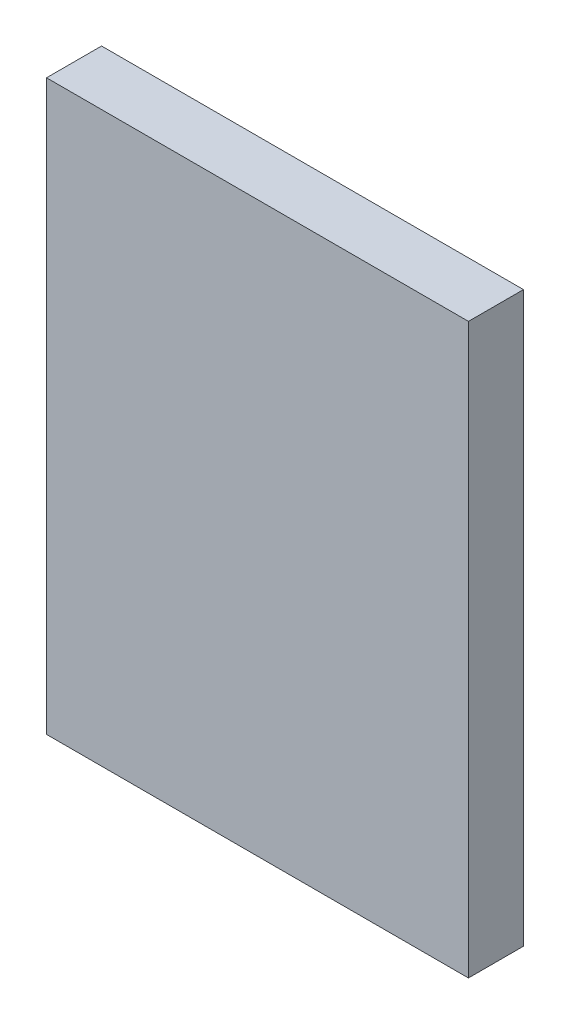
ISO-10303-21;
HEADER;
FILE_DESCRIPTION(('STEP AP214'),'2;1');
FILE_NAME('part.step','',(''),(''),'','','');
FILE_SCHEMA(('AUTOMOTIVE_DESIGN { 1 0 10303 214 1 1 1 1 }'));
ENDSEC;
DATA;
#1=APPLICATION_CONTEXT('core data for automotive mechanical design processes');
#2=APPLICATION_PROTOCOL_DEFINITION('international standard','automotive_design',2000,#1);
#3=PRODUCT_CONTEXT('',#1,'mechanical');
#4=PRODUCT('Part','Part','',(#3));
#5=PRODUCT_RELATED_PRODUCT_CATEGORY('part','',(#4));
#6=PRODUCT_DEFINITION_FORMATION('','',#4);
#7=PRODUCT_DEFINITION_CONTEXT('part definition',#1,'design');
#8=PRODUCT_DEFINITION('design','',#6,#7);
#9=PRODUCT_DEFINITION_SHAPE('','',#8);
#10=(LENGTH_UNIT() NAMED_UNIT(*) SI_UNIT(.MILLI.,.METRE.));
#11=(NAMED_UNIT(*) PLANE_ANGLE_UNIT() SI_UNIT($,.RADIAN.));
#12=(NAMED_UNIT(*) SI_UNIT($,.STERADIAN.) SOLID_ANGLE_UNIT());
#13=UNCERTAINTY_MEASURE_WITH_UNIT(LENGTH_MEASURE(1.E-05),#10,'distance_accuracy_value','');
#14=(GEOMETRIC_REPRESENTATION_CONTEXT(3) GLOBAL_UNCERTAINTY_ASSIGNED_CONTEXT((#13)) GLOBAL_UNIT_ASSIGNED_CONTEXT((#10,
#11,#12)) REPRESENTATION_CONTEXT('',''));
#15=CARTESIAN_POINT('',(0.,0.,0.));
#16=DIRECTION('',(0.,0.,1.));
#17=DIRECTION('',(1.,0.,0.));
#18=AXIS2_PLACEMENT_3D('',#15,#16,#17);
#19=CARTESIAN_POINT('',(5.75,-7.75,1.5));
#20=DIRECTION('',(-1.,0.,0.));
#21=DIRECTION('',(0.,0.,1.));
#22=AXIS2_PLACEMENT_3D('',#19,#20,#21);
#23=PLANE('',#22);
#24=DIRECTION('',(0.,1.,0.));
#25=VECTOR('',#24,1.);
#26=CARTESIAN_POINT('',(5.75,-7.75,0.));
#27=LINE('',#26,#25);
#28=CARTESIAN_POINT('',(5.75,-7.75,0.));
#29=VERTEX_POINT('',#28);
#30=CARTESIAN_POINT('',(5.75,7.75,0.));
#31=VERTEX_POINT('',#30);
#32=EDGE_CURVE('E96',#29,#31,#27,.T.);
#33=ORIENTED_EDGE('',*,*,#32,.T.);
#34=DIRECTION('',(0.,0.,-1.));
#35=VECTOR('',#34,1.);
#36=CARTESIAN_POINT('',(5.75,7.75,1.5));
#37=LINE('',#36,#35);
#38=CARTESIAN_POINT('',(5.75,7.75,1.5));
#39=VERTEX_POINT('',#38);
#40=EDGE_CURVE('E11',#39,#31,#37,.T.);
#41=ORIENTED_EDGE('',*,*,#40,.F.);
#42=DIRECTION('',(0.,1.,0.));
#43=VECTOR('',#42,1.);
#44=CARTESIAN_POINT('',(5.75,-7.75,1.5));
#45=LINE('',#44,#43);
#46=CARTESIAN_POINT('',(5.75,-7.75,1.5));
#47=VERTEX_POINT('',#46);
#48=EDGE_CURVE('E82',#47,#39,#45,.T.);
#49=ORIENTED_EDGE('',*,*,#48,.F.);
#50=DIRECTION('',(0.,0.,-1.));
#51=VECTOR('',#50,1.);
#52=CARTESIAN_POINT('',(5.75,-7.75,1.5));
#53=LINE('',#52,#51);
#54=EDGE_CURVE('E49',#47,#29,#53,.T.);
#55=ORIENTED_EDGE('',*,*,#54,.T.);
#56=EDGE_LOOP('',(#33,#41,#49,#55));
#57=FACE_BOUND('',#56,.T.);
#58=ADVANCED_FACE('F33',(#57),#23,.F.);
#59=CARTESIAN_POINT('',(5.75,7.75,1.5));
#60=DIRECTION('',(0.,-1.,0.));
#61=DIRECTION('',(0.,0.,-1.));
#62=AXIS2_PLACEMENT_3D('',#59,#60,#61);
#63=PLANE('',#62);
#64=DIRECTION('',(-1.,0.,0.));
#65=VECTOR('',#64,1.);
#66=CARTESIAN_POINT('',(5.75,7.75,0.));
#67=LINE('',#66,#65);
#68=CARTESIAN_POINT('',(-5.75,7.75,0.));
#69=VERTEX_POINT('',#68);
#70=EDGE_CURVE('E87',#31,#69,#67,.T.);
#71=ORIENTED_EDGE('',*,*,#70,.T.);
#72=DIRECTION('',(0.,0.,-1.));
#73=VECTOR('',#72,1.);
#74=CARTESIAN_POINT('',(-5.75,7.75,1.5));
#75=LINE('',#74,#73);
#76=CARTESIAN_POINT('',(-5.75,7.75,1.5));
#77=VERTEX_POINT('',#76);
#78=EDGE_CURVE('E41',#77,#69,#75,.T.);
#79=ORIENTED_EDGE('',*,*,#78,.F.);
#80=DIRECTION('',(-1.,0.,0.));
#81=VECTOR('',#80,1.);
#82=CARTESIAN_POINT('',(5.75,7.75,1.5));
#83=LINE('',#82,#81);
#84=EDGE_CURVE('E74',#39,#77,#83,.T.);
#85=ORIENTED_EDGE('',*,*,#84,.F.);
#86=ORIENTED_EDGE('',*,*,#40,.T.);
#87=EDGE_LOOP('',(#71,#79,#85,#86));
#88=FACE_BOUND('',#87,.T.);
#89=ADVANCED_FACE('F86',(#88),#63,.F.);
#90=CARTESIAN_POINT('',(-5.75,-7.75,1.5));
#91=DIRECTION('',(-1.,0.,0.));
#92=DIRECTION('',(0.,0.,1.));
#93=AXIS2_PLACEMENT_3D('',#90,#91,#92);
#94=PLANE('',#93);
#95=DIRECTION('',(0.,1.,0.));
#96=VECTOR('',#95,1.);
#97=CARTESIAN_POINT('',(-5.75,-7.75,0.));
#98=LINE('',#97,#96);
#99=CARTESIAN_POINT('',(-5.75,-7.75,0.));
#100=VERTEX_POINT('',#99);
#101=EDGE_CURVE('E99',#100,#69,#98,.T.);
#102=ORIENTED_EDGE('',*,*,#101,.F.);
#103=DIRECTION('',(0.,0.,-1.));
#104=VECTOR('',#103,1.);
#105=CARTESIAN_POINT('',(-5.75,-7.75,1.5));
#106=LINE('',#105,#104);
#107=CARTESIAN_POINT('',(-5.75,-7.75,1.5));
#108=VERTEX_POINT('',#107);
#109=EDGE_CURVE('E63',#108,#100,#106,.T.);
#110=ORIENTED_EDGE('',*,*,#109,.F.);
#111=DIRECTION('',(0.,1.,0.));
#112=VECTOR('',#111,1.);
#113=CARTESIAN_POINT('',(-5.75,-7.75,1.5));
#114=LINE('',#113,#112);
#115=EDGE_CURVE('E81',#108,#77,#114,.T.);
#116=ORIENTED_EDGE('',*,*,#115,.T.);
#117=ORIENTED_EDGE('',*,*,#78,.T.);
#118=EDGE_LOOP('',(#102,#110,#116,#117));
#119=FACE_BOUND('',#118,.T.);
#120=ADVANCED_FACE('F90',(#119),#94,.T.);
#121=CARTESIAN_POINT('',(5.75,-7.75,1.5));
#122=DIRECTION('',(0.,-1.,0.));
#123=DIRECTION('',(0.,0.,-1.));
#124=AXIS2_PLACEMENT_3D('',#121,#122,#123);
#125=PLANE('',#124);
#126=DIRECTION('',(-1.,0.,0.));
#127=VECTOR('',#126,1.);
#128=CARTESIAN_POINT('',(5.75,-7.75,0.));
#129=LINE('',#128,#127);
#130=EDGE_CURVE('E101',#29,#100,#129,.T.);
#131=ORIENTED_EDGE('',*,*,#130,.F.);
#132=ORIENTED_EDGE('',*,*,#54,.F.);
#133=DIRECTION('',(-1.,0.,0.));
#134=VECTOR('',#133,1.);
#135=CARTESIAN_POINT('',(5.75,-7.75,1.5));
#136=LINE('',#135,#134);
#137=EDGE_CURVE('E91',#47,#108,#136,.T.);
#138=ORIENTED_EDGE('',*,*,#137,.T.);
#139=ORIENTED_EDGE('',*,*,#109,.T.);
#140=EDGE_LOOP('',(#131,#132,#138,#139));
#141=FACE_BOUND('',#140,.T.);
#142=ADVANCED_FACE('F107',(#141),#125,.T.);
#143=CARTESIAN_POINT('',(0.,0.,1.5));
#144=DIRECTION('',(0.,0.,1.));
#145=DIRECTION('',(1.,0.,0.));
#146=AXIS2_PLACEMENT_3D('',#143,#144,#145);
#147=PLANE('',#146);
#148=ORIENTED_EDGE('',*,*,#48,.T.);
#149=ORIENTED_EDGE('',*,*,#84,.T.);
#150=ORIENTED_EDGE('',*,*,#115,.F.);
#151=ORIENTED_EDGE('',*,*,#137,.F.);
#152=EDGE_LOOP('',(#148,#149,#150,#151));
#153=FACE_BOUND('',#152,.T.);
#154=ADVANCED_FACE('F78',(#153),#147,.T.);
#155=CARTESIAN_POINT('',(0.,0.,0.));
#156=DIRECTION('',(0.,0.,1.));
#157=DIRECTION('',(1.,0.,0.));
#158=AXIS2_PLACEMENT_3D('',#155,#156,#157);
#159=PLANE('',#158);
#160=ORIENTED_EDGE('',*,*,#32,.F.);
#161=ORIENTED_EDGE('',*,*,#130,.T.);
#162=ORIENTED_EDGE('',*,*,#101,.T.);
#163=ORIENTED_EDGE('',*,*,#70,.F.);
#164=EDGE_LOOP('',(#160,#161,#162,#163));
#165=FACE_BOUND('',#164,.T.);
#166=ADVANCED_FACE('F106',(#165),#159,.F.);
#167=CLOSED_SHELL('',(#58,#89,#120,#142,#154,#166));
#168=MANIFOLD_SOLID_BREP('B2',#167);
#169=ADVANCED_BREP_SHAPE_REPRESENTATION('',(#18,#168),#14);
#170=SHAPE_DEFINITION_REPRESENTATION(#9,#169);
ENDSEC;
END-ISO-10303-21;
